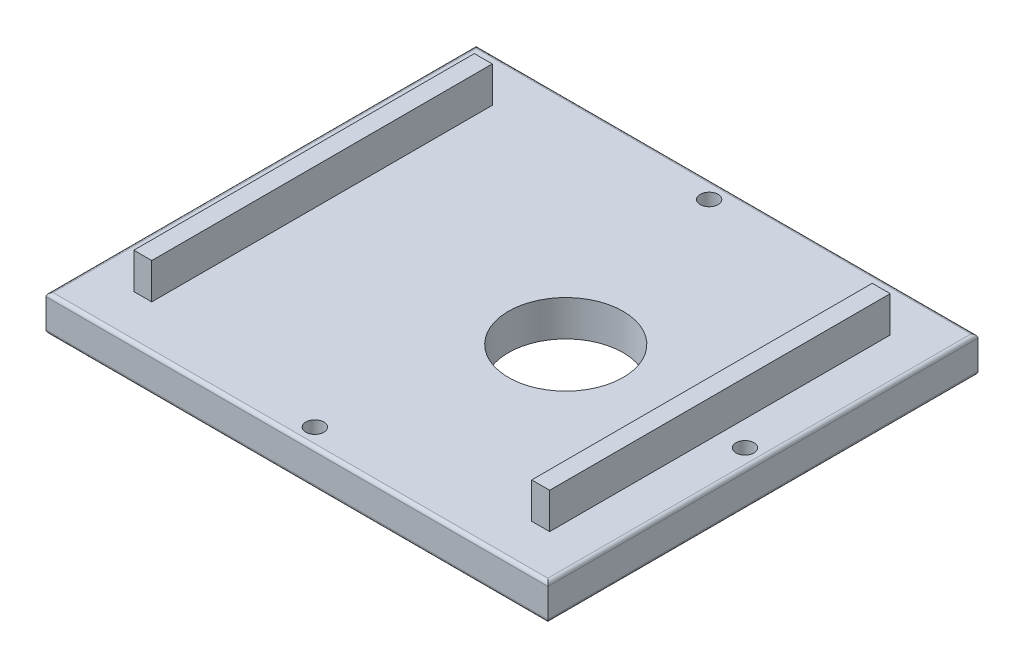
ISO-10303-21;
HEADER;
FILE_DESCRIPTION(('STEP AP214'),'2;1');
FILE_NAME('part.step','',(''),(''),'','','');
FILE_SCHEMA(('AUTOMOTIVE_DESIGN { 1 0 10303 214 1 1 1 1 }'));
ENDSEC;
DATA;
#1=APPLICATION_CONTEXT('core data for automotive mechanical design processes');
#2=APPLICATION_PROTOCOL_DEFINITION('international standard','automotive_design',2000,#1);
#3=PRODUCT_CONTEXT('',#1,'mechanical');
#4=PRODUCT('Part','Part','',(#3));
#5=PRODUCT_RELATED_PRODUCT_CATEGORY('part','',(#4));
#6=PRODUCT_DEFINITION_FORMATION('','',#4);
#7=PRODUCT_DEFINITION_CONTEXT('part definition',#1,'design');
#8=PRODUCT_DEFINITION('design','',#6,#7);
#9=PRODUCT_DEFINITION_SHAPE('','',#8);
#10=(LENGTH_UNIT() NAMED_UNIT(*) SI_UNIT(.MILLI.,.METRE.));
#11=(NAMED_UNIT(*) PLANE_ANGLE_UNIT() SI_UNIT($,.RADIAN.));
#12=(NAMED_UNIT(*) SI_UNIT($,.STERADIAN.) SOLID_ANGLE_UNIT());
#13=UNCERTAINTY_MEASURE_WITH_UNIT(LENGTH_MEASURE(1.E-05),#10,'distance_accuracy_value','');
#14=(GEOMETRIC_REPRESENTATION_CONTEXT(3) GLOBAL_UNCERTAINTY_ASSIGNED_CONTEXT((#13)) GLOBAL_UNIT_ASSIGNED_CONTEXT((#10,
#11,#12)) REPRESENTATION_CONTEXT('',''));
#15=CARTESIAN_POINT('',(0.,0.,0.));
#16=DIRECTION('',(0.,0.,1.));
#17=DIRECTION('',(1.,0.,0.));
#18=AXIS2_PLACEMENT_3D('',#15,#16,#17);
#19=CARTESIAN_POINT('',(0.,10.,0.));
#20=DIRECTION('',(0.,-1.,0.));
#21=DIRECTION('',(0.,0.,-1.));
#22=AXIS2_PLACEMENT_3D('',#19,#20,#21);
#23=PLANE('',#22);
#24=DIRECTION('',(-1.,0.,0.));
#25=VECTOR('',#24,1.);
#26=CARTESIAN_POINT('',(0.,10.,-59.));
#27=LINE('',#26,#25);
#28=CARTESIAN_POINT('',(69.,10.,-59.));
#29=VERTEX_POINT('',#28);
#30=CARTESIAN_POINT('',(-69.,10.,-59.));
#31=VERTEX_POINT('',#30);
#32=EDGE_CURVE('E229',#29,#31,#27,.T.);
#33=ORIENTED_EDGE('',*,*,#32,.T.);
#34=DIRECTION('',(0.,0.,1.));
#35=VECTOR('',#34,1.);
#36=CARTESIAN_POINT('',(-69.,10.,0.));
#37=LINE('',#36,#35);
#38=CARTESIAN_POINT('',(-69.,10.,59.));
#39=VERTEX_POINT('',#38);
#40=EDGE_CURVE('E233',#31,#39,#37,.T.);
#41=ORIENTED_EDGE('',*,*,#40,.T.);
#42=DIRECTION('',(1.,0.,0.));
#43=VECTOR('',#42,1.);
#44=CARTESIAN_POINT('',(0.,10.,59.));
#45=LINE('',#44,#43);
#46=CARTESIAN_POINT('',(69.,10.,59.));
#47=VERTEX_POINT('',#46);
#48=EDGE_CURVE('E231',#39,#47,#45,.T.);
#49=ORIENTED_EDGE('',*,*,#48,.T.);
#50=DIRECTION('',(0.,0.,-1.));
#51=VECTOR('',#50,1.);
#52=CARTESIAN_POINT('',(69.,10.,0.));
#53=LINE('',#52,#51);
#54=EDGE_CURVE('E227',#47,#29,#53,.T.);
#55=ORIENTED_EDGE('',*,*,#54,.T.);
#56=EDGE_LOOP('',(#33,#41,#49,#55));
#57=FACE_BOUND('',#56,.T.);
#58=CARTESIAN_POINT('',(15.,10.,0.));
#59=DIRECTION('',(0.,-1.,0.));
#60=DIRECTION('',(0.,0.,-1.));
#61=AXIS2_PLACEMENT_3D('',#58,#59,#60);
#62=CIRCLE('',#61,16.);
#63=CARTESIAN_POINT('',(15.,10.,-16.));
#64=VERTEX_POINT('',#63);
#65=EDGE_CURVE('E631',#64,#64,#62,.F.);
#66=ORIENTED_EDGE('',*,*,#65,.F.);
#67=EDGE_LOOP('',(#66));
#68=FACE_BOUND('',#67,.T.);
#69=CARTESIAN_POINT('',(65.,10.,0.));
#70=DIRECTION('',(0.,-1.,0.));
#71=DIRECTION('',(0.,0.,-1.));
#72=AXIS2_PLACEMENT_3D('',#69,#70,#71);
#73=CIRCLE('',#72,2.5);
#74=CARTESIAN_POINT('',(65.,10.,-2.5));
#75=VERTEX_POINT('',#74);
#76=EDGE_CURVE('E641',#75,#75,#73,.T.);
#77=ORIENTED_EDGE('',*,*,#76,.T.);
#78=EDGE_LOOP('',(#77));
#79=FACE_BOUND('',#78,.T.);
#80=CARTESIAN_POINT('',(0.,10.,-55.));
#81=DIRECTION('',(0.,-1.,0.));
#82=DIRECTION('',(0.,0.,-1.));
#83=AXIS2_PLACEMENT_3D('',#80,#81,#82);
#84=CIRCLE('',#83,2.5);
#85=CARTESIAN_POINT('',(0.,10.,-57.5));
#86=VERTEX_POINT('',#85);
#87=EDGE_CURVE('E650',#86,#86,#84,.T.);
#88=ORIENTED_EDGE('',*,*,#87,.T.);
#89=EDGE_LOOP('',(#88));
#90=FACE_BOUND('',#89,.T.);
#91=CARTESIAN_POINT('',(0.,10.,55.));
#92=DIRECTION('',(0.,-1.,0.));
#93=DIRECTION('',(0.,0.,-1.));
#94=AXIS2_PLACEMENT_3D('',#91,#92,#93);
#95=CIRCLE('',#94,2.5);
#96=CARTESIAN_POINT('',(0.,10.,52.5));
#97=VERTEX_POINT('',#96);
#98=EDGE_CURVE('E659',#97,#97,#95,.T.);
#99=ORIENTED_EDGE('',*,*,#98,.T.);
#100=EDGE_LOOP('',(#99));
#101=FACE_BOUND('',#100,.T.);
#102=CARTESIAN_POINT('',(-65.,10.,0.));
#103=DIRECTION('',(0.,-1.,0.));
#104=DIRECTION('',(0.,0.,-1.));
#105=AXIS2_PLACEMENT_3D('',#102,#103,#104);
#106=CIRCLE('',#105,2.5);
#107=CARTESIAN_POINT('',(-65.,10.,-2.5));
#108=VERTEX_POINT('',#107);
#109=EDGE_CURVE('E668',#108,#108,#106,.T.);
#110=ORIENTED_EDGE('',*,*,#109,.T.);
#111=EDGE_LOOP('',(#110));
#112=FACE_BOUND('',#111,.T.);
#113=DIRECTION('',(0.,0.,1.));
#114=VECTOR('',#113,1.);
#115=CARTESIAN_POINT('',(-58.,10.,-47.5));
#116=LINE('',#115,#114);
#117=CARTESIAN_POINT('',(-58.,10.,-47.5));
#118=VERTEX_POINT('',#117);
#119=CARTESIAN_POINT('',(-58.,10.,47.5));
#120=VERTEX_POINT('',#119);
#121=EDGE_CURVE('E177',#118,#120,#116,.T.);
#122=ORIENTED_EDGE('',*,*,#121,.F.);
#123=DIRECTION('',(-1.,0.,0.));
#124=VECTOR('',#123,1.);
#125=CARTESIAN_POINT('',(-58.,10.,-47.5));
#126=LINE('',#125,#124);
#127=CARTESIAN_POINT('',(-53.,10.,-47.5));
#128=VERTEX_POINT('',#127);
#129=EDGE_CURVE('E190',#128,#118,#126,.T.);
#130=ORIENTED_EDGE('',*,*,#129,.F.);
#131=DIRECTION('',(0.,0.,-1.));
#132=VECTOR('',#131,1.);
#133=CARTESIAN_POINT('',(-53.,10.,-47.5));
#134=LINE('',#133,#132);
#135=CARTESIAN_POINT('',(-53.,10.,47.5));
#136=VERTEX_POINT('',#135);
#137=EDGE_CURVE('E199',#136,#128,#134,.T.);
#138=ORIENTED_EDGE('',*,*,#137,.F.);
#139=DIRECTION('',(1.,0.,0.));
#140=VECTOR('',#139,1.);
#141=CARTESIAN_POINT('',(-58.,10.,47.5));
#142=LINE('',#141,#140);
#143=EDGE_CURVE('E180',#120,#136,#142,.T.);
#144=ORIENTED_EDGE('',*,*,#143,.F.);
#145=EDGE_LOOP('',(#122,#130,#138,#144));
#146=FACE_BOUND('',#145,.T.);
#147=DIRECTION('',(0.,0.,-1.));
#148=VECTOR('',#147,1.);
#149=CARTESIAN_POINT('',(58.,10.,-47.5));
#150=LINE('',#149,#148);
#151=CARTESIAN_POINT('',(58.,10.,47.4999999999999));
#152=VERTEX_POINT('',#151);
#153=CARTESIAN_POINT('',(58.,10.,-47.5));
#154=VERTEX_POINT('',#153);
#155=EDGE_CURVE('E176',#152,#154,#150,.T.);
#156=ORIENTED_EDGE('',*,*,#155,.F.);
#157=DIRECTION('',(1.,0.,0.));
#158=VECTOR('',#157,1.);
#159=CARTESIAN_POINT('',(58.,10.,47.4999999999999));
#160=LINE('',#159,#158);
#161=CARTESIAN_POINT('',(53.,10.,47.5));
#162=VERTEX_POINT('',#161);
#163=EDGE_CURVE('E173',#162,#152,#160,.T.);
#164=ORIENTED_EDGE('',*,*,#163,.F.);
#165=DIRECTION('',(0.,0.,1.));
#166=VECTOR('',#165,1.);
#167=CARTESIAN_POINT('',(53.,10.,-47.5));
#168=LINE('',#167,#166);
#169=CARTESIAN_POINT('',(53.,10.,-47.5));
#170=VERTEX_POINT('',#169);
#171=EDGE_CURVE('E677',#170,#162,#168,.T.);
#172=ORIENTED_EDGE('',*,*,#171,.F.);
#173=DIRECTION('',(-1.,0.,0.));
#174=VECTOR('',#173,1.);
#175=CARTESIAN_POINT('',(58.,10.,-47.5));
#176=LINE('',#175,#174);
#177=EDGE_CURVE('E675',#154,#170,#176,.T.);
#178=ORIENTED_EDGE('',*,*,#177,.F.);
#179=EDGE_LOOP('',(#156,#164,#172,#178));
#180=FACE_BOUND('',#179,.T.);
#181=ADVANCED_FACE('F37',(#57,#68,#79,#90,#101,#112,#146,#180),#23,.F.);
#182=CARTESIAN_POINT('',(-70.,10.,60.));
#183=DIRECTION('',(1.,0.,0.));
#184=DIRECTION('',(0.,0.,-1.));
#185=AXIS2_PLACEMENT_3D('',#182,#183,#184);
#186=PLANE('',#185);
#187=DIRECTION('',(0.,-1.,0.));
#188=VECTOR('',#187,1.);
#189=CARTESIAN_POINT('',(-70.,10.,60.));
#190=LINE('',#189,#188);
#191=CARTESIAN_POINT('',(-70.,9.,60.));
#192=VERTEX_POINT('',#191);
#193=CARTESIAN_POINT('',(-70.,0.999999999999999,60.));
#194=VERTEX_POINT('',#193);
#195=EDGE_CURVE('E224',#192,#194,#190,.T.);
#196=ORIENTED_EDGE('',*,*,#195,.F.);
#197=DIRECTION('',(0.,0.,1.));
#198=VECTOR('',#197,1.);
#199=CARTESIAN_POINT('',(-70.,9.,60.));
#200=LINE('',#199,#198);
#201=CARTESIAN_POINT('',(-70.,9.,-60.));
#202=VERTEX_POINT('',#201);
#203=EDGE_CURVE('E238',#192,#202,#200,.F.);
#204=ORIENTED_EDGE('',*,*,#203,.T.);
#205=DIRECTION('',(0.,-1.,0.));
#206=VECTOR('',#205,1.);
#207=CARTESIAN_POINT('',(-70.,10.,-60.));
#208=LINE('',#207,#206);
#209=CARTESIAN_POINT('',(-70.,0.999999999999999,-60.));
#210=VERTEX_POINT('',#209);
#211=EDGE_CURVE('E215',#202,#210,#208,.T.);
#212=ORIENTED_EDGE('',*,*,#211,.T.);
#213=DIRECTION('',(0.,0.,1.));
#214=VECTOR('',#213,1.);
#215=CARTESIAN_POINT('',(-70.,0.999999999999999,60.));
#216=LINE('',#215,#214);
#217=EDGE_CURVE('E236',#210,#194,#216,.T.);
#218=ORIENTED_EDGE('',*,*,#217,.T.);
#219=EDGE_LOOP('',(#196,#204,#212,#218));
#220=FACE_BOUND('',#219,.T.);
#221=ADVANCED_FACE('F308',(#220),#186,.F.);
#222=CARTESIAN_POINT('',(-70.,10.,60.));
#223=DIRECTION('',(0.,0.,-1.));
#224=DIRECTION('',(-1.,0.,0.));
#225=AXIS2_PLACEMENT_3D('',#222,#223,#224);
#226=PLANE('',#225);
#227=DIRECTION('',(0.,-1.,0.));
#228=VECTOR('',#227,1.);
#229=CARTESIAN_POINT('',(70.,10.,60.));
#230=LINE('',#229,#228);
#231=CARTESIAN_POINT('',(70.,9.,60.));
#232=VERTEX_POINT('',#231);
#233=CARTESIAN_POINT('',(70.,0.999999999999999,60.));
#234=VERTEX_POINT('',#233);
#235=EDGE_CURVE('E221',#232,#234,#230,.T.);
#236=ORIENTED_EDGE('',*,*,#235,.F.);
#237=DIRECTION('',(1.,0.,0.));
#238=VECTOR('',#237,1.);
#239=CARTESIAN_POINT('',(-70.,9.,60.));
#240=LINE('',#239,#238);
#241=EDGE_CURVE('E243',#232,#192,#240,.F.);
#242=ORIENTED_EDGE('',*,*,#241,.T.);
#243=ORIENTED_EDGE('',*,*,#195,.T.);
#244=DIRECTION('',(1.,0.,0.));
#245=VECTOR('',#244,1.);
#246=CARTESIAN_POINT('',(70.,0.999999999999999,60.));
#247=LINE('',#246,#245);
#248=EDGE_CURVE('E241',#194,#234,#247,.T.);
#249=ORIENTED_EDGE('',*,*,#248,.T.);
#250=EDGE_LOOP('',(#236,#242,#243,#249));
#251=FACE_BOUND('',#250,.T.);
#252=ADVANCED_FACE('F323',(#251),#226,.F.);
#253=CARTESIAN_POINT('',(70.,10.,60.));
#254=DIRECTION('',(-1.,0.,0.));
#255=DIRECTION('',(0.,0.,1.));
#256=AXIS2_PLACEMENT_3D('',#253,#254,#255);
#257=PLANE('',#256);
#258=DIRECTION('',(0.,-1.,0.));
#259=VECTOR('',#258,1.);
#260=CARTESIAN_POINT('',(70.,10.,-60.));
#261=LINE('',#260,#259);
#262=CARTESIAN_POINT('',(70.,9.,-60.));
#263=VERTEX_POINT('',#262);
#264=CARTESIAN_POINT('',(70.,0.999999999999999,-60.));
#265=VERTEX_POINT('',#264);
#266=EDGE_CURVE('E218',#263,#265,#261,.T.);
#267=ORIENTED_EDGE('',*,*,#266,.F.);
#268=DIRECTION('',(0.,0.,-1.));
#269=VECTOR('',#268,1.);
#270=CARTESIAN_POINT('',(70.,9.,60.));
#271=LINE('',#270,#269);
#272=EDGE_CURVE('E252',#263,#232,#271,.F.);
#273=ORIENTED_EDGE('',*,*,#272,.T.);
#274=ORIENTED_EDGE('',*,*,#235,.T.);
#275=DIRECTION('',(0.,0.,-1.));
#276=VECTOR('',#275,1.);
#277=CARTESIAN_POINT('',(70.,0.999999999999999,-60.));
#278=LINE('',#277,#276);
#279=EDGE_CURVE('E249',#234,#265,#278,.T.);
#280=ORIENTED_EDGE('',*,*,#279,.T.);
#281=EDGE_LOOP('',(#267,#273,#274,#280));
#282=FACE_BOUND('',#281,.T.);
#283=ADVANCED_FACE('F294',(#282),#257,.F.);
#284=CARTESIAN_POINT('',(-70.,10.,-60.));
#285=DIRECTION('',(0.,0.,1.));
#286=DIRECTION('',(1.,0.,0.));
#287=AXIS2_PLACEMENT_3D('',#284,#285,#286);
#288=PLANE('',#287);
#289=ORIENTED_EDGE('',*,*,#211,.F.);
#290=DIRECTION('',(-1.,0.,0.));
#291=VECTOR('',#290,1.);
#292=CARTESIAN_POINT('',(-70.,9.,-60.));
#293=LINE('',#292,#291);
#294=EDGE_CURVE('E247',#202,#263,#293,.F.);
#295=ORIENTED_EDGE('',*,*,#294,.T.);
#296=ORIENTED_EDGE('',*,*,#266,.T.);
#297=DIRECTION('',(-1.,0.,0.));
#298=VECTOR('',#297,1.);
#299=CARTESIAN_POINT('',(-70.,0.999999999999999,-60.));
#300=LINE('',#299,#298);
#301=EDGE_CURVE('E245',#265,#210,#300,.T.);
#302=ORIENTED_EDGE('',*,*,#301,.T.);
#303=EDGE_LOOP('',(#289,#295,#296,#302));
#304=FACE_BOUND('',#303,.T.);
#305=ADVANCED_FACE('F297',(#304),#288,.F.);
#306=CARTESIAN_POINT('',(0.,0.,0.));
#307=DIRECTION('',(0.,-1.,0.));
#308=DIRECTION('',(0.,0.,-1.));
#309=AXIS2_PLACEMENT_3D('',#306,#307,#308);
#310=PLANE('',#309);
#311=DIRECTION('',(-1.,0.,0.));
#312=VECTOR('',#311,1.);
#313=CARTESIAN_POINT('',(70.,0.,-59.));
#314=LINE('',#313,#312);
#315=CARTESIAN_POINT('',(-69.,0.,-59.));
#316=VERTEX_POINT('',#315);
#317=CARTESIAN_POINT('',(69.,0.,-59.));
#318=VERTEX_POINT('',#317);
#319=EDGE_CURVE('E254',#316,#318,#314,.F.);
#320=ORIENTED_EDGE('',*,*,#319,.T.);
#321=DIRECTION('',(0.,0.,-1.));
#322=VECTOR('',#321,1.);
#323=CARTESIAN_POINT('',(69.,0.,60.));
#324=LINE('',#323,#322);
#325=CARTESIAN_POINT('',(69.,0.,59.));
#326=VERTEX_POINT('',#325);
#327=EDGE_CURVE('E11',#318,#326,#324,.F.);
#328=ORIENTED_EDGE('',*,*,#327,.T.);
#329=DIRECTION('',(1.,0.,0.));
#330=VECTOR('',#329,1.);
#331=CARTESIAN_POINT('',(-70.,0.,59.));
#332=LINE('',#331,#330);
#333=CARTESIAN_POINT('',(-69.,0.,59.));
#334=VERTEX_POINT('',#333);
#335=EDGE_CURVE('E46',#326,#334,#332,.F.);
#336=ORIENTED_EDGE('',*,*,#335,.T.);
#337=DIRECTION('',(0.,0.,1.));
#338=VECTOR('',#337,1.);
#339=CARTESIAN_POINT('',(-69.,0.,-60.));
#340=LINE('',#339,#338);
#341=EDGE_CURVE('E256',#334,#316,#340,.F.);
#342=ORIENTED_EDGE('',*,*,#341,.T.);
#343=EDGE_LOOP('',(#320,#328,#336,#342));
#344=FACE_BOUND('',#343,.T.);
#345=CARTESIAN_POINT('',(15.,0.,0.));
#346=DIRECTION('',(0.,-1.,0.));
#347=DIRECTION('',(0.,0.,-1.));
#348=AXIS2_PLACEMENT_3D('',#345,#346,#347);
#349=CIRCLE('',#348,16.);
#350=CARTESIAN_POINT('',(15.,0.,-16.));
#351=VERTEX_POINT('',#350);
#352=EDGE_CURVE('E269',#351,#351,#349,.T.);
#353=ORIENTED_EDGE('',*,*,#352,.F.);
#354=EDGE_LOOP('',(#353));
#355=FACE_BOUND('',#354,.T.);
#356=CARTESIAN_POINT('',(65.,0.,0.));
#357=DIRECTION('',(0.,-1.,0.));
#358=DIRECTION('',(0.,0.,-1.));
#359=AXIS2_PLACEMENT_3D('',#356,#357,#358);
#360=CIRCLE('',#359,3.025);
#361=CARTESIAN_POINT('',(65.,0.,-3.025));
#362=VERTEX_POINT('',#361);
#363=EDGE_CURVE('E632',#362,#362,#360,.T.);
#364=ORIENTED_EDGE('',*,*,#363,.F.);
#365=EDGE_LOOP('',(#364));
#366=FACE_BOUND('',#365,.T.);
#367=CARTESIAN_POINT('',(0.,0.,-55.));
#368=DIRECTION('',(0.,-1.,0.));
#369=DIRECTION('',(0.,0.,-1.));
#370=AXIS2_PLACEMENT_3D('',#367,#368,#369);
#371=CIRCLE('',#370,3.025);
#372=CARTESIAN_POINT('',(0.,0.,-58.025));
#373=VERTEX_POINT('',#372);
#374=EDGE_CURVE('E644',#373,#373,#371,.T.);
#375=ORIENTED_EDGE('',*,*,#374,.F.);
#376=EDGE_LOOP('',(#375));
#377=FACE_BOUND('',#376,.T.);
#378=CARTESIAN_POINT('',(0.,0.,55.));
#379=DIRECTION('',(0.,-1.,0.));
#380=DIRECTION('',(0.,0.,-1.));
#381=AXIS2_PLACEMENT_3D('',#378,#379,#380);
#382=CIRCLE('',#381,3.025);
#383=CARTESIAN_POINT('',(0.,0.,51.975));
#384=VERTEX_POINT('',#383);
#385=EDGE_CURVE('E653',#384,#384,#382,.T.);
#386=ORIENTED_EDGE('',*,*,#385,.F.);
#387=EDGE_LOOP('',(#386));
#388=FACE_BOUND('',#387,.T.);
#389=CARTESIAN_POINT('',(-65.,0.,0.));
#390=DIRECTION('',(0.,-1.,0.));
#391=DIRECTION('',(0.,0.,-1.));
#392=AXIS2_PLACEMENT_3D('',#389,#390,#391);
#393=CIRCLE('',#392,3.025);
#394=CARTESIAN_POINT('',(-65.,0.,-3.025));
#395=VERTEX_POINT('',#394);
#396=EDGE_CURVE('E662',#395,#395,#393,.T.);
#397=ORIENTED_EDGE('',*,*,#396,.F.);
#398=EDGE_LOOP('',(#397));
#399=FACE_BOUND('',#398,.T.);
#400=ADVANCED_FACE('F285',(#344,#355,#366,#377,#388,#399),#310,.T.);
#401=CARTESIAN_POINT('',(-58.,20.,-47.5));
#402=DIRECTION('',(1.,0.,0.));
#403=DIRECTION('',(0.,0.,-1.));
#404=AXIS2_PLACEMENT_3D('',#401,#402,#403);
#405=PLANE('',#404);
#406=ORIENTED_EDGE('',*,*,#121,.T.);
#407=DIRECTION('',(0.,-1.,0.));
#408=VECTOR('',#407,1.);
#409=CARTESIAN_POINT('',(-58.,20.,47.5));
#410=LINE('',#409,#408);
#411=CARTESIAN_POINT('',(-58.,20.,47.5));
#412=VERTEX_POINT('',#411);
#413=EDGE_CURVE('E212',#412,#120,#410,.T.);
#414=ORIENTED_EDGE('',*,*,#413,.F.);
#415=DIRECTION('',(0.,0.,1.));
#416=VECTOR('',#415,1.);
#417=CARTESIAN_POINT('',(-58.,20.,-47.5));
#418=LINE('',#417,#416);
#419=CARTESIAN_POINT('',(-58.,20.,-47.5));
#420=VERTEX_POINT('',#419);
#421=EDGE_CURVE('E186',#420,#412,#418,.T.);
#422=ORIENTED_EDGE('',*,*,#421,.F.);
#423=DIRECTION('',(0.,-1.,0.));
#424=VECTOR('',#423,1.);
#425=CARTESIAN_POINT('',(-58.,20.,-47.5));
#426=LINE('',#425,#424);
#427=EDGE_CURVE('E195',#420,#118,#426,.T.);
#428=ORIENTED_EDGE('',*,*,#427,.T.);
#429=EDGE_LOOP('',(#406,#414,#422,#428));
#430=FACE_BOUND('',#429,.T.);
#431=ADVANCED_FACE('F338',(#430),#405,.F.);
#432=CARTESIAN_POINT('',(-58.,20.,47.5));
#433=DIRECTION('',(0.,0.,-1.));
#434=DIRECTION('',(-1.,0.,0.));
#435=AXIS2_PLACEMENT_3D('',#432,#433,#434);
#436=PLANE('',#435);
#437=ORIENTED_EDGE('',*,*,#143,.T.);
#438=DIRECTION('',(0.,-1.,0.));
#439=VECTOR('',#438,1.);
#440=CARTESIAN_POINT('',(-53.,20.,47.5));
#441=LINE('',#440,#439);
#442=CARTESIAN_POINT('',(-53.,20.,47.5));
#443=VERTEX_POINT('',#442);
#444=EDGE_CURVE('E209',#443,#136,#441,.T.);
#445=ORIENTED_EDGE('',*,*,#444,.F.);
#446=DIRECTION('',(1.,0.,0.));
#447=VECTOR('',#446,1.);
#448=CARTESIAN_POINT('',(-58.,20.,47.5));
#449=LINE('',#448,#447);
#450=EDGE_CURVE('E189',#412,#443,#449,.T.);
#451=ORIENTED_EDGE('',*,*,#450,.F.);
#452=ORIENTED_EDGE('',*,*,#413,.T.);
#453=EDGE_LOOP('',(#437,#445,#451,#452));
#454=FACE_BOUND('',#453,.T.);
#455=ADVANCED_FACE('F358',(#454),#436,.F.);
#456=CARTESIAN_POINT('',(-53.,20.,-47.5));
#457=DIRECTION('',(-1.,0.,0.));
#458=DIRECTION('',(0.,0.,1.));
#459=AXIS2_PLACEMENT_3D('',#456,#457,#458);
#460=PLANE('',#459);
#461=ORIENTED_EDGE('',*,*,#137,.T.);
#462=DIRECTION('',(0.,-1.,0.));
#463=VECTOR('',#462,1.);
#464=CARTESIAN_POINT('',(-53.,20.,-47.5));
#465=LINE('',#464,#463);
#466=CARTESIAN_POINT('',(-53.,20.,-47.5));
#467=VERTEX_POINT('',#466);
#468=EDGE_CURVE('E206',#467,#128,#465,.T.);
#469=ORIENTED_EDGE('',*,*,#468,.F.);
#470=DIRECTION('',(0.,0.,-1.));
#471=VECTOR('',#470,1.);
#472=CARTESIAN_POINT('',(-53.,20.,-47.5));
#473=LINE('',#472,#471);
#474=EDGE_CURVE('E192',#443,#467,#473,.T.);
#475=ORIENTED_EDGE('',*,*,#474,.F.);
#476=ORIENTED_EDGE('',*,*,#444,.T.);
#477=EDGE_LOOP('',(#461,#469,#475,#476));
#478=FACE_BOUND('',#477,.T.);
#479=ADVANCED_FACE('F365',(#478),#460,.F.);
#480=CARTESIAN_POINT('',(-58.,20.,-47.5));
#481=DIRECTION('',(0.,0.,1.));
#482=DIRECTION('',(1.,0.,0.));
#483=AXIS2_PLACEMENT_3D('',#480,#481,#482);
#484=PLANE('',#483);
#485=ORIENTED_EDGE('',*,*,#129,.T.);
#486=ORIENTED_EDGE('',*,*,#427,.F.);
#487=DIRECTION('',(-1.,0.,0.));
#488=VECTOR('',#487,1.);
#489=CARTESIAN_POINT('',(-58.,20.,-47.5));
#490=LINE('',#489,#488);
#491=EDGE_CURVE('E194',#467,#420,#490,.T.);
#492=ORIENTED_EDGE('',*,*,#491,.F.);
#493=ORIENTED_EDGE('',*,*,#468,.T.);
#494=EDGE_LOOP('',(#485,#486,#492,#493));
#495=FACE_BOUND('',#494,.T.);
#496=ADVANCED_FACE('F372',(#495),#484,.F.);
#497=CARTESIAN_POINT('',(0.,20.,0.));
#498=DIRECTION('',(0.,1.,0.));
#499=DIRECTION('',(0.,0.,1.));
#500=AXIS2_PLACEMENT_3D('',#497,#498,#499);
#501=PLANE('',#500);
#502=ORIENTED_EDGE('',*,*,#421,.T.);
#503=ORIENTED_EDGE('',*,*,#450,.T.);
#504=ORIENTED_EDGE('',*,*,#474,.T.);
#505=ORIENTED_EDGE('',*,*,#491,.T.);
#506=EDGE_LOOP('',(#502,#503,#504,#505));
#507=FACE_BOUND('',#506,.T.);
#508=ADVANCED_FACE('F380',(#507),#501,.T.);
#509=CARTESIAN_POINT('',(58.,20.,-47.5));
#510=DIRECTION('',(-1.,0.,0.));
#511=DIRECTION('',(0.,0.,1.));
#512=AXIS2_PLACEMENT_3D('',#509,#510,#511);
#513=PLANE('',#512);
#514=ORIENTED_EDGE('',*,*,#155,.T.);
#515=DIRECTION('',(0.,-1.,0.));
#516=VECTOR('',#515,1.);
#517=CARTESIAN_POINT('',(58.,20.,-47.5));
#518=LINE('',#517,#516);
#519=CARTESIAN_POINT('',(58.,20.,-47.5));
#520=VERTEX_POINT('',#519);
#521=EDGE_CURVE('E157',#520,#154,#518,.T.);
#522=ORIENTED_EDGE('',*,*,#521,.F.);
#523=DIRECTION('',(0.,0.,-1.));
#524=VECTOR('',#523,1.);
#525=CARTESIAN_POINT('',(58.,20.,-47.5));
#526=LINE('',#525,#524);
#527=CARTESIAN_POINT('',(58.,20.,47.4999999999999));
#528=VERTEX_POINT('',#527);
#529=EDGE_CURVE('E164',#528,#520,#526,.T.);
#530=ORIENTED_EDGE('',*,*,#529,.F.);
#531=DIRECTION('',(0.,-1.,0.));
#532=VECTOR('',#531,1.);
#533=CARTESIAN_POINT('',(58.,20.,47.4999999999999));
#534=LINE('',#533,#532);
#535=EDGE_CURVE('E673',#528,#152,#534,.T.);
#536=ORIENTED_EDGE('',*,*,#535,.T.);
#537=EDGE_LOOP('',(#514,#522,#530,#536));
#538=FACE_BOUND('',#537,.T.);
#539=ADVANCED_FACE('F175',(#538),#513,.F.);
#540=CARTESIAN_POINT('',(58.,20.,-47.5));
#541=DIRECTION('',(0.,0.,1.));
#542=DIRECTION('',(1.,0.,0.));
#543=AXIS2_PLACEMENT_3D('',#540,#541,#542);
#544=PLANE('',#543);
#545=ORIENTED_EDGE('',*,*,#177,.T.);
#546=DIRECTION('',(0.,-1.,0.));
#547=VECTOR('',#546,1.);
#548=CARTESIAN_POINT('',(53.,20.,-47.5));
#549=LINE('',#548,#547);
#550=CARTESIAN_POINT('',(53.,20.,-47.5));
#551=VERTEX_POINT('',#550);
#552=EDGE_CURVE('E160',#551,#170,#549,.T.);
#553=ORIENTED_EDGE('',*,*,#552,.F.);
#554=DIRECTION('',(-1.,0.,0.));
#555=VECTOR('',#554,1.);
#556=CARTESIAN_POINT('',(58.,20.,-47.5));
#557=LINE('',#556,#555);
#558=EDGE_CURVE('E152',#520,#551,#557,.T.);
#559=ORIENTED_EDGE('',*,*,#558,.F.);
#560=ORIENTED_EDGE('',*,*,#521,.T.);
#561=EDGE_LOOP('',(#545,#553,#559,#560));
#562=FACE_BOUND('',#561,.T.);
#563=ADVANCED_FACE('F155',(#562),#544,.F.);
#564=CARTESIAN_POINT('',(53.,20.,-47.5));
#565=DIRECTION('',(1.,0.,0.));
#566=DIRECTION('',(0.,0.,-1.));
#567=AXIS2_PLACEMENT_3D('',#564,#565,#566);
#568=PLANE('',#567);
#569=ORIENTED_EDGE('',*,*,#171,.T.);
#570=DIRECTION('',(0.,-1.,0.));
#571=VECTOR('',#570,1.);
#572=CARTESIAN_POINT('',(53.,20.,47.5));
#573=LINE('',#572,#571);
#574=CARTESIAN_POINT('',(53.,20.,47.5));
#575=VERTEX_POINT('',#574);
#576=EDGE_CURVE('E182',#575,#162,#573,.T.);
#577=ORIENTED_EDGE('',*,*,#576,.F.);
#578=DIRECTION('',(0.,0.,1.));
#579=VECTOR('',#578,1.);
#580=CARTESIAN_POINT('',(53.,20.,-47.5));
#581=LINE('',#580,#579);
#582=EDGE_CURVE('E163',#551,#575,#581,.T.);
#583=ORIENTED_EDGE('',*,*,#582,.F.);
#584=ORIENTED_EDGE('',*,*,#552,.T.);
#585=EDGE_LOOP('',(#569,#577,#583,#584));
#586=FACE_BOUND('',#585,.T.);
#587=ADVANCED_FACE('F401',(#586),#568,.F.);
#588=CARTESIAN_POINT('',(58.,20.,47.4999999999999));
#589=DIRECTION('',(0.,0.,-1.));
#590=DIRECTION('',(-1.,0.,0.));
#591=AXIS2_PLACEMENT_3D('',#588,#589,#590);
#592=PLANE('',#591);
#593=ORIENTED_EDGE('',*,*,#163,.T.);
#594=ORIENTED_EDGE('',*,*,#535,.F.);
#595=DIRECTION('',(1.,0.,0.));
#596=VECTOR('',#595,1.);
#597=CARTESIAN_POINT('',(58.,20.,47.4999999999999));
#598=LINE('',#597,#596);
#599=EDGE_CURVE('E169',#575,#528,#598,.T.);
#600=ORIENTED_EDGE('',*,*,#599,.F.);
#601=ORIENTED_EDGE('',*,*,#576,.T.);
#602=EDGE_LOOP('',(#593,#594,#600,#601));
#603=FACE_BOUND('',#602,.T.);
#604=ADVANCED_FACE('F408',(#603),#592,.F.);
#605=CARTESIAN_POINT('',(0.,20.,0.));
#606=DIRECTION('',(0.,-1.,0.));
#607=DIRECTION('',(0.,0.,-1.));
#608=AXIS2_PLACEMENT_3D('',#605,#606,#607);
#609=PLANE('',#608);
#610=ORIENTED_EDGE('',*,*,#529,.T.);
#611=ORIENTED_EDGE('',*,*,#558,.T.);
#612=ORIENTED_EDGE('',*,*,#582,.T.);
#613=ORIENTED_EDGE('',*,*,#599,.T.);
#614=EDGE_LOOP('',(#610,#611,#612,#613));
#615=FACE_BOUND('',#614,.T.);
#616=ADVANCED_FACE('F167',(#615),#609,.F.);
#617=CARTESIAN_POINT('',(-65.,0.,0.));
#618=DIRECTION('',(0.,-1.,0.));
#619=DIRECTION('',(0.,0.,-1.));
#620=AXIS2_PLACEMENT_3D('',#617,#618,#619);
#621=CYLINDRICAL_SURFACE('',#620,2.5);
#622=ORIENTED_EDGE('',*,*,#109,.F.);
#623=EDGE_LOOP('',(#622));
#624=FACE_BOUND('',#623,.T.);
#625=CARTESIAN_POINT('',(-65.,0.525000000000001,0.));
#626=DIRECTION('',(0.,-1.,0.));
#627=DIRECTION('',(0.,0.,-1.));
#628=AXIS2_PLACEMENT_3D('',#625,#626,#627);
#629=CIRCLE('',#628,2.5);
#630=CARTESIAN_POINT('',(-65.,0.525000000000001,-2.5));
#631=VERTEX_POINT('',#630);
#632=EDGE_CURVE('E665',#631,#631,#629,.T.);
#633=ORIENTED_EDGE('',*,*,#632,.T.);
#634=EDGE_LOOP('',(#633));
#635=FACE_BOUND('',#634,.T.);
#636=ADVANCED_FACE('F423',(#624,#635),#621,.F.);
#637=CARTESIAN_POINT('',(-65.,0.,0.));
#638=DIRECTION('',(0.,-1.,0.));
#639=DIRECTION('',(0.,0.,-1.));
#640=AXIS2_PLACEMENT_3D('',#637,#638,#639);
#641=CONICAL_SURFACE('',#640,3.025,0.785398163397444);
#642=ORIENTED_EDGE('',*,*,#632,.F.);
#643=EDGE_LOOP('',(#642));
#644=FACE_BOUND('',#643,.T.);
#645=ORIENTED_EDGE('',*,*,#396,.T.);
#646=EDGE_LOOP('',(#645));
#647=FACE_BOUND('',#646,.T.);
#648=ADVANCED_FACE('F431',(#644,#647),#641,.F.);
#649=CARTESIAN_POINT('',(0.,0.,55.));
#650=DIRECTION('',(0.,-1.,0.));
#651=DIRECTION('',(0.,0.,-1.));
#652=AXIS2_PLACEMENT_3D('',#649,#650,#651);
#653=CYLINDRICAL_SURFACE('',#652,2.5);
#654=ORIENTED_EDGE('',*,*,#98,.F.);
#655=EDGE_LOOP('',(#654));
#656=FACE_BOUND('',#655,.T.);
#657=CARTESIAN_POINT('',(0.,0.525000000000001,55.));
#658=DIRECTION('',(0.,-1.,0.));
#659=DIRECTION('',(0.,0.,-1.));
#660=AXIS2_PLACEMENT_3D('',#657,#658,#659);
#661=CIRCLE('',#660,2.5);
#662=CARTESIAN_POINT('',(0.,0.525000000000001,52.5));
#663=VERTEX_POINT('',#662);
#664=EDGE_CURVE('E656',#663,#663,#661,.T.);
#665=ORIENTED_EDGE('',*,*,#664,.T.);
#666=EDGE_LOOP('',(#665));
#667=FACE_BOUND('',#666,.T.);
#668=ADVANCED_FACE('F439',(#656,#667),#653,.F.);
#669=CARTESIAN_POINT('',(0.,0.,55.));
#670=DIRECTION('',(0.,-1.,0.));
#671=DIRECTION('',(0.,0.,-1.));
#672=AXIS2_PLACEMENT_3D('',#669,#670,#671);
#673=CONICAL_SURFACE('',#672,3.025,0.785398163397447);
#674=ORIENTED_EDGE('',*,*,#664,.F.);
#675=EDGE_LOOP('',(#674));
#676=FACE_BOUND('',#675,.T.);
#677=ORIENTED_EDGE('',*,*,#385,.T.);
#678=EDGE_LOOP('',(#677));
#679=FACE_BOUND('',#678,.T.);
#680=ADVANCED_FACE('F447',(#676,#679),#673,.F.);
#681=CARTESIAN_POINT('',(0.,0.,-55.));
#682=DIRECTION('',(0.,-1.,0.));
#683=DIRECTION('',(0.,0.,-1.));
#684=AXIS2_PLACEMENT_3D('',#681,#682,#683);
#685=CYLINDRICAL_SURFACE('',#684,2.5);
#686=ORIENTED_EDGE('',*,*,#87,.F.);
#687=EDGE_LOOP('',(#686));
#688=FACE_BOUND('',#687,.T.);
#689=CARTESIAN_POINT('',(0.,0.525000000000001,-55.));
#690=DIRECTION('',(0.,-1.,0.));
#691=DIRECTION('',(0.,0.,-1.));
#692=AXIS2_PLACEMENT_3D('',#689,#690,#691);
#693=CIRCLE('',#692,2.5);
#694=CARTESIAN_POINT('',(0.,0.525000000000001,-57.5));
#695=VERTEX_POINT('',#694);
#696=EDGE_CURVE('E647',#695,#695,#693,.T.);
#697=ORIENTED_EDGE('',*,*,#696,.T.);
#698=EDGE_LOOP('',(#697));
#699=FACE_BOUND('',#698,.T.);
#700=ADVANCED_FACE('F455',(#688,#699),#685,.F.);
#701=CARTESIAN_POINT('',(0.,0.,-55.));
#702=DIRECTION('',(0.,-1.,0.));
#703=DIRECTION('',(0.,0.,-1.));
#704=AXIS2_PLACEMENT_3D('',#701,#702,#703);
#705=CONICAL_SURFACE('',#704,3.025,0.785398163397447);
#706=ORIENTED_EDGE('',*,*,#696,.F.);
#707=EDGE_LOOP('',(#706));
#708=FACE_BOUND('',#707,.T.);
#709=ORIENTED_EDGE('',*,*,#374,.T.);
#710=EDGE_LOOP('',(#709));
#711=FACE_BOUND('',#710,.T.);
#712=ADVANCED_FACE('F463',(#708,#711),#705,.F.);
#713=CARTESIAN_POINT('',(65.,0.,0.));
#714=DIRECTION('',(0.,-1.,0.));
#715=DIRECTION('',(0.,0.,-1.));
#716=AXIS2_PLACEMENT_3D('',#713,#714,#715);
#717=CYLINDRICAL_SURFACE('',#716,2.5);
#718=ORIENTED_EDGE('',*,*,#76,.F.);
#719=EDGE_LOOP('',(#718));
#720=FACE_BOUND('',#719,.T.);
#721=CARTESIAN_POINT('',(65.,0.525000000000001,0.));
#722=DIRECTION('',(0.,-1.,0.));
#723=DIRECTION('',(0.,0.,-1.));
#724=AXIS2_PLACEMENT_3D('',#721,#722,#723);
#725=CIRCLE('',#724,2.5);
#726=CARTESIAN_POINT('',(65.,0.525000000000001,-2.5));
#727=VERTEX_POINT('',#726);
#728=EDGE_CURVE('E635',#727,#727,#725,.T.);
#729=ORIENTED_EDGE('',*,*,#728,.T.);
#730=EDGE_LOOP('',(#729));
#731=FACE_BOUND('',#730,.T.);
#732=ADVANCED_FACE('F471',(#720,#731),#717,.F.);
#733=CARTESIAN_POINT('',(65.,0.,0.));
#734=DIRECTION('',(0.,-1.,0.));
#735=DIRECTION('',(0.,0.,-1.));
#736=AXIS2_PLACEMENT_3D('',#733,#734,#735);
#737=CONICAL_SURFACE('',#736,3.025,0.785398163397444);
#738=ORIENTED_EDGE('',*,*,#728,.F.);
#739=EDGE_LOOP('',(#738));
#740=FACE_BOUND('',#739,.T.);
#741=ORIENTED_EDGE('',*,*,#363,.T.);
#742=EDGE_LOOP('',(#741));
#743=FACE_BOUND('',#742,.T.);
#744=ADVANCED_FACE('F479',(#740,#743),#737,.F.);
#745=CARTESIAN_POINT('',(15.,20.001,0.));
#746=DIRECTION('',(0.,-1.,0.));
#747=DIRECTION('',(0.,0.,-1.));
#748=AXIS2_PLACEMENT_3D('',#745,#746,#747);
#749=CYLINDRICAL_SURFACE('',#748,16.);
#750=ORIENTED_EDGE('',*,*,#352,.T.);
#751=EDGE_LOOP('',(#750));
#752=FACE_BOUND('',#751,.T.);
#753=ORIENTED_EDGE('',*,*,#65,.T.);
#754=EDGE_LOOP('',(#753));
#755=FACE_BOUND('',#754,.T.);
#756=ADVANCED_FACE('F486',(#752,#755),#749,.F.);
#757=CARTESIAN_POINT('',(69.,9.,0.));
#758=DIRECTION('',(0.,0.,-1.));
#759=DIRECTION('',(-1.,0.,0.));
#760=AXIS2_PLACEMENT_3D('',#757,#758,#759);
#761=CYLINDRICAL_SURFACE('',#760,1.);
#762=CARTESIAN_POINT('',(69.,9.,59.));
#763=DIRECTION('',(0.707106781186548,0.,-0.707106781186547));
#764=DIRECTION('',(-0.707106781186547,0.,-0.707106781186548));
#765=AXIS2_PLACEMENT_3D('',#762,#763,#764);
#766=ELLIPSE('',#765,1.41421356237309,1.);
#767=EDGE_CURVE('E263',#232,#47,#766,.F.);
#768=ORIENTED_EDGE('',*,*,#767,.F.);
#769=ORIENTED_EDGE('',*,*,#272,.F.);
#770=CARTESIAN_POINT('',(69.,9.,-59.));
#771=DIRECTION('',(-0.707106781186547,0.,-0.707106781186548));
#772=DIRECTION('',(0.707106781186548,0.,-0.707106781186547));
#773=AXIS2_PLACEMENT_3D('',#770,#771,#772);
#774=ELLIPSE('',#773,1.4142135623731,1.);
#775=EDGE_CURVE('E266',#29,#263,#774,.T.);
#776=ORIENTED_EDGE('',*,*,#775,.F.);
#777=ORIENTED_EDGE('',*,*,#54,.F.);
#778=EDGE_LOOP('',(#768,#769,#776,#777));
#779=FACE_BOUND('',#778,.T.);
#780=ADVANCED_FACE('F321',(#779),#761,.T.);
#781=CARTESIAN_POINT('',(0.,9.,-59.));
#782=DIRECTION('',(-1.,0.,0.));
#783=DIRECTION('',(0.,0.,1.));
#784=AXIS2_PLACEMENT_3D('',#781,#782,#783);
#785=CYLINDRICAL_SURFACE('',#784,1.);
#786=ORIENTED_EDGE('',*,*,#775,.T.);
#787=ORIENTED_EDGE('',*,*,#294,.F.);
#788=CARTESIAN_POINT('',(-69.,9.,-59.));
#789=DIRECTION('',(-0.707106781186547,0.,0.707106781186548));
#790=DIRECTION('',(-0.707106781186548,0.,-0.707106781186547));
#791=AXIS2_PLACEMENT_3D('',#788,#789,#790);
#792=ELLIPSE('',#791,1.4142135623731,1.);
#793=EDGE_CURVE('E261',#31,#202,#792,.T.);
#794=ORIENTED_EDGE('',*,*,#793,.F.);
#795=ORIENTED_EDGE('',*,*,#32,.F.);
#796=EDGE_LOOP('',(#786,#787,#794,#795));
#797=FACE_BOUND('',#796,.T.);
#798=ADVANCED_FACE('F301',(#797),#785,.T.);
#799=CARTESIAN_POINT('',(0.,9.,59.));
#800=DIRECTION('',(1.,0.,0.));
#801=DIRECTION('',(0.,0.,-1.));
#802=AXIS2_PLACEMENT_3D('',#799,#800,#801);
#803=CYLINDRICAL_SURFACE('',#802,1.);
#804=ORIENTED_EDGE('',*,*,#767,.T.);
#805=ORIENTED_EDGE('',*,*,#48,.F.);
#806=CARTESIAN_POINT('',(-69.,9.,59.));
#807=DIRECTION('',(0.707106781186548,0.,0.707106781186547));
#808=DIRECTION('',(0.707106781186547,0.,-0.707106781186548));
#809=AXIS2_PLACEMENT_3D('',#806,#807,#808);
#810=ELLIPSE('',#809,1.41421356237309,1.);
#811=EDGE_CURVE('E259',#192,#39,#810,.F.);
#812=ORIENTED_EDGE('',*,*,#811,.F.);
#813=ORIENTED_EDGE('',*,*,#241,.F.);
#814=EDGE_LOOP('',(#804,#805,#812,#813));
#815=FACE_BOUND('',#814,.T.);
#816=ADVANCED_FACE('F315',(#815),#803,.T.);
#817=CARTESIAN_POINT('',(-69.,9.,0.));
#818=DIRECTION('',(0.,0.,1.));
#819=DIRECTION('',(1.,0.,0.));
#820=AXIS2_PLACEMENT_3D('',#817,#818,#819);
#821=CYLINDRICAL_SURFACE('',#820,1.);
#822=ORIENTED_EDGE('',*,*,#793,.T.);
#823=ORIENTED_EDGE('',*,*,#203,.F.);
#824=ORIENTED_EDGE('',*,*,#811,.T.);
#825=ORIENTED_EDGE('',*,*,#40,.F.);
#826=EDGE_LOOP('',(#822,#823,#824,#825));
#827=FACE_BOUND('',#826,.T.);
#828=ADVANCED_FACE('F311',(#827),#821,.T.);
#829=CARTESIAN_POINT('',(-69.,0.999999999999999,60.));
#830=DIRECTION('',(0.,0.,-1.));
#831=DIRECTION('',(-1.,0.,0.));
#832=AXIS2_PLACEMENT_3D('',#829,#830,#831);
#833=CYLINDRICAL_SURFACE('',#832,1.);
#834=CARTESIAN_POINT('',(-69.,0.999999999999999,-59.));
#835=DIRECTION('',(0.707106781186547,0.,-0.707106781186548));
#836=DIRECTION('',(0.707106781186548,0.,0.707106781186547));
#837=AXIS2_PLACEMENT_3D('',#834,#835,#836);
#838=ELLIPSE('',#837,1.4142135623731,1.);
#839=EDGE_CURVE('E272',#316,#210,#838,.T.);
#840=ORIENTED_EDGE('',*,*,#839,.F.);
#841=ORIENTED_EDGE('',*,*,#341,.F.);
#842=CARTESIAN_POINT('',(-69.,0.999999999999999,59.));
#843=DIRECTION('',(-0.707106781186548,0.,-0.707106781186547));
#844=DIRECTION('',(0.707106781186547,0.,-0.707106781186548));
#845=AXIS2_PLACEMENT_3D('',#842,#843,#844);
#846=ELLIPSE('',#845,1.41421356237309,1.);
#847=EDGE_CURVE('E41',#194,#334,#846,.F.);
#848=ORIENTED_EDGE('',*,*,#847,.F.);
#849=ORIENTED_EDGE('',*,*,#217,.F.);
#850=EDGE_LOOP('',(#840,#841,#848,#849));
#851=FACE_BOUND('',#850,.T.);
#852=ADVANCED_FACE('F39',(#851),#833,.T.);
#853=CARTESIAN_POINT('',(-70.,0.999999999999999,59.));
#854=DIRECTION('',(-1.,0.,0.));
#855=DIRECTION('',(0.,0.,1.));
#856=AXIS2_PLACEMENT_3D('',#853,#854,#855);
#857=CYLINDRICAL_SURFACE('',#856,1.);
#858=ORIENTED_EDGE('',*,*,#847,.T.);
#859=ORIENTED_EDGE('',*,*,#335,.F.);
#860=CARTESIAN_POINT('',(69.,0.999999999999999,59.));
#861=DIRECTION('',(-0.707106781186548,0.,0.707106781186547));
#862=DIRECTION('',(-0.707106781186547,0.,-0.707106781186548));
#863=AXIS2_PLACEMENT_3D('',#860,#861,#862);
#864=ELLIPSE('',#863,1.41421356237309,1.);
#865=EDGE_CURVE('E54',#234,#326,#864,.F.);
#866=ORIENTED_EDGE('',*,*,#865,.F.);
#867=ORIENTED_EDGE('',*,*,#248,.F.);
#868=EDGE_LOOP('',(#858,#859,#866,#867));
#869=FACE_BOUND('',#868,.T.);
#870=ADVANCED_FACE('F282',(#869),#857,.T.);
#871=CARTESIAN_POINT('',(-70.,0.999999999999999,-59.));
#872=DIRECTION('',(1.,0.,0.));
#873=DIRECTION('',(0.,0.,-1.));
#874=AXIS2_PLACEMENT_3D('',#871,#872,#873);
#875=CYLINDRICAL_SURFACE('',#874,1.);
#876=ORIENTED_EDGE('',*,*,#839,.T.);
#877=ORIENTED_EDGE('',*,*,#301,.F.);
#878=CARTESIAN_POINT('',(69.,0.999999999999999,-59.));
#879=DIRECTION('',(0.707106781186547,0.,0.707106781186548));
#880=DIRECTION('',(0.707106781186548,0.,-0.707106781186547));
#881=AXIS2_PLACEMENT_3D('',#878,#879,#880);
#882=ELLIPSE('',#881,1.4142135623731,1.);
#883=EDGE_CURVE('E270',#318,#265,#882,.T.);
#884=ORIENTED_EDGE('',*,*,#883,.F.);
#885=ORIENTED_EDGE('',*,*,#319,.F.);
#886=EDGE_LOOP('',(#876,#877,#884,#885));
#887=FACE_BOUND('',#886,.T.);
#888=ADVANCED_FACE('F289',(#887),#875,.T.);
#889=CARTESIAN_POINT('',(69.,0.999999999999999,60.));
#890=DIRECTION('',(0.,0.,1.));
#891=DIRECTION('',(1.,0.,0.));
#892=AXIS2_PLACEMENT_3D('',#889,#890,#891);
#893=CYLINDRICAL_SURFACE('',#892,1.);
#894=ORIENTED_EDGE('',*,*,#865,.T.);
#895=ORIENTED_EDGE('',*,*,#327,.F.);
#896=ORIENTED_EDGE('',*,*,#883,.T.);
#897=ORIENTED_EDGE('',*,*,#279,.F.);
#898=EDGE_LOOP('',(#894,#895,#896,#897));
#899=FACE_BOUND('',#898,.T.);
#900=ADVANCED_FACE('F288',(#899),#893,.T.);
#901=CLOSED_SHELL('',(#181,#221,#252,#283,#305,#400,#431,#455,#479,#496,#508,#539,#563,#587,
#604,#616,#636,#648,#668,#680,#700,#712,#732,#744,#756,#780,#798,#816,#828,#852,#870,#888,#900));
#902=MANIFOLD_SOLID_BREP('B2',#901);
#903=ADVANCED_BREP_SHAPE_REPRESENTATION('',(#18,#902),#14);
#904=SHAPE_DEFINITION_REPRESENTATION(#9,#903);
ENDSEC;
END-ISO-10303-21;
